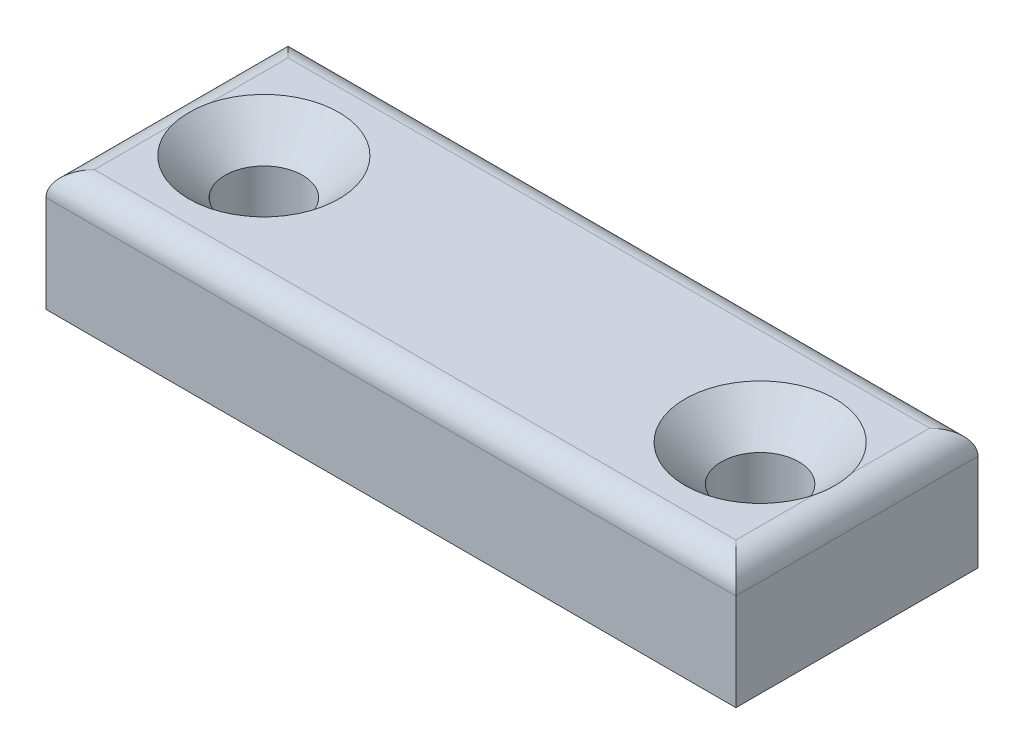
ISO-10303-21;
HEADER;
FILE_DESCRIPTION(('STEP AP214'),'2;1');
FILE_NAME('part.step','',(''),(''),'','','');
FILE_SCHEMA(('AUTOMOTIVE_DESIGN { 1 0 10303 214 1 1 1 1 }'));
ENDSEC;
DATA;
#1=APPLICATION_CONTEXT('core data for automotive mechanical design processes');
#2=APPLICATION_PROTOCOL_DEFINITION('international standard','automotive_design',2000,#1);
#3=PRODUCT_CONTEXT('',#1,'mechanical');
#4=PRODUCT('Part','Part','',(#3));
#5=PRODUCT_RELATED_PRODUCT_CATEGORY('part','',(#4));
#6=PRODUCT_DEFINITION_FORMATION('','',#4);
#7=PRODUCT_DEFINITION_CONTEXT('part definition',#1,'design');
#8=PRODUCT_DEFINITION('design','',#6,#7);
#9=PRODUCT_DEFINITION_SHAPE('','',#8);
#10=(LENGTH_UNIT() NAMED_UNIT(*) SI_UNIT(.MILLI.,.METRE.));
#11=(NAMED_UNIT(*) PLANE_ANGLE_UNIT() SI_UNIT($,.RADIAN.));
#12=(NAMED_UNIT(*) SI_UNIT($,.STERADIAN.) SOLID_ANGLE_UNIT());
#13=UNCERTAINTY_MEASURE_WITH_UNIT(LENGTH_MEASURE(1.E-05),#10,'distance_accuracy_value','');
#14=(GEOMETRIC_REPRESENTATION_CONTEXT(3) GLOBAL_UNCERTAINTY_ASSIGNED_CONTEXT((#13)) GLOBAL_UNIT_ASSIGNED_CONTEXT((#10,
#11,#12)) REPRESENTATION_CONTEXT('',''));
#15=CARTESIAN_POINT('',(0.,0.,0.));
#16=DIRECTION('',(0.,0.,1.));
#17=DIRECTION('',(1.,0.,0.));
#18=AXIS2_PLACEMENT_3D('',#15,#16,#17);
#19=CARTESIAN_POINT('',(0.,5.,0.));
#20=DIRECTION('',(0.,1.,0.));
#21=DIRECTION('',(0.,0.,1.));
#22=AXIS2_PLACEMENT_3D('',#19,#20,#21);
#23=PLANE('',#22);
#24=DIRECTION('',(0.,0.,1.));
#25=VECTOR('',#24,1.);
#26=CARTESIAN_POINT('',(-27.5,5.,0.));
#27=LINE('',#26,#25);
#28=CARTESIAN_POINT('',(-27.5,5.,-9.));
#29=VERTEX_POINT('',#28);
#30=CARTESIAN_POINT('',(-27.5,5.,-5.78102496759069));
#31=VERTEX_POINT('',#30);
#32=EDGE_CURVE('E159',#29,#31,#27,.T.);
#33=ORIENTED_EDGE('',*,*,#32,.T.);
#34=CARTESIAN_POINT('',(-24.5,5.,-5.));
#35=DIRECTION('',(0.,1.,0.));
#36=DIRECTION('',(0.,0.,1.));
#37=AXIS2_PLACEMENT_3D('',#34,#35,#36);
#38=CIRCLE('',#37,3.10000000000001);
#39=CARTESIAN_POINT('',(-27.5,5.,-4.2189750324093));
#40=VERTEX_POINT('',#39);
#41=EDGE_CURVE('E184',#31,#40,#38,.F.);
#42=ORIENTED_EDGE('',*,*,#41,.T.);
#43=CARTESIAN_POINT('',(-27.5,5.,-0.999999999999997));
#44=VERTEX_POINT('',#43);
#45=EDGE_CURVE('E158',#40,#44,#27,.T.);
#46=ORIENTED_EDGE('',*,*,#45,.T.);
#47=DIRECTION('',(1.,0.,0.));
#48=VECTOR('',#47,1.);
#49=CARTESIAN_POINT('',(0.,5.,-1.));
#50=LINE('',#49,#48);
#51=CARTESIAN_POINT('',(-1.,5.,-1.));
#52=VERTEX_POINT('',#51);
#53=EDGE_CURVE('E153',#44,#52,#50,.T.);
#54=ORIENTED_EDGE('',*,*,#53,.T.);
#55=DIRECTION('',(0.,0.,-1.));
#56=VECTOR('',#55,1.);
#57=CARTESIAN_POINT('',(-1.,5.,-10.));
#58=LINE('',#57,#56);
#59=CARTESIAN_POINT('',(-1.,5.,-4.21897503240932));
#60=VERTEX_POINT('',#59);
#61=EDGE_CURVE('E151',#52,#60,#58,.T.);
#62=ORIENTED_EDGE('',*,*,#61,.T.);
#63=CARTESIAN_POINT('',(-4.,5.,-5.));
#64=DIRECTION('',(0.,1.,0.));
#65=DIRECTION('',(0.,0.,1.));
#66=AXIS2_PLACEMENT_3D('',#63,#64,#65);
#67=CIRCLE('',#66,3.1);
#68=CARTESIAN_POINT('',(-1.,5.,-5.78102496759067));
#69=VERTEX_POINT('',#68);
#70=EDGE_CURVE('E182',#60,#69,#67,.F.);
#71=ORIENTED_EDGE('',*,*,#70,.T.);
#72=CARTESIAN_POINT('',(-1.,5.,-9.));
#73=VERTEX_POINT('',#72);
#74=EDGE_CURVE('E121',#69,#73,#58,.T.);
#75=ORIENTED_EDGE('',*,*,#74,.T.);
#76=DIRECTION('',(-1.,0.,0.));
#77=VECTOR('',#76,1.);
#78=CARTESIAN_POINT('',(-28.5,5.,-9.));
#79=LINE('',#78,#77);
#80=EDGE_CURVE('E155',#73,#29,#79,.T.);
#81=ORIENTED_EDGE('',*,*,#80,.T.);
#82=EDGE_LOOP('',(#33,#42,#46,#54,#62,#71,#75,#81));
#83=FACE_BOUND('',#82,.T.);
#84=ADVANCED_FACE('F40',(#83),#23,.T.);
#85=CARTESIAN_POINT('',(0.,0.,0.));
#86=DIRECTION('',(0.,1.,0.));
#87=DIRECTION('',(0.,0.,1.));
#88=AXIS2_PLACEMENT_3D('',#85,#86,#87);
#89=PLANE('',#88);
#90=DIRECTION('',(0.,0.,-1.));
#91=VECTOR('',#90,1.);
#92=CARTESIAN_POINT('',(0.,0.,0.));
#93=LINE('',#92,#91);
#94=CARTESIAN_POINT('',(0.,0.,0.));
#95=VERTEX_POINT('',#94);
#96=CARTESIAN_POINT('',(0.,0.,-10.));
#97=VERTEX_POINT('',#96);
#98=EDGE_CURVE('E129',#95,#97,#93,.T.);
#99=ORIENTED_EDGE('',*,*,#98,.F.);
#100=DIRECTION('',(1.,0.,0.));
#101=VECTOR('',#100,1.);
#102=CARTESIAN_POINT('',(0.,0.,0.));
#103=LINE('',#102,#101);
#104=CARTESIAN_POINT('',(-28.5,0.,0.));
#105=VERTEX_POINT('',#104);
#106=EDGE_CURVE('E145',#105,#95,#103,.T.);
#107=ORIENTED_EDGE('',*,*,#106,.F.);
#108=DIRECTION('',(0.,0.,1.));
#109=VECTOR('',#108,1.);
#110=CARTESIAN_POINT('',(-28.5,0.,0.));
#111=LINE('',#110,#109);
#112=CARTESIAN_POINT('',(-28.5,0.,-10.));
#113=VERTEX_POINT('',#112);
#114=EDGE_CURVE('E131',#113,#105,#111,.T.);
#115=ORIENTED_EDGE('',*,*,#114,.F.);
#116=DIRECTION('',(-1.,0.,0.));
#117=VECTOR('',#116,1.);
#118=CARTESIAN_POINT('',(0.,0.,-10.));
#119=LINE('',#118,#117);
#120=EDGE_CURVE('E115',#97,#113,#119,.T.);
#121=ORIENTED_EDGE('',*,*,#120,.F.);
#122=EDGE_LOOP('',(#99,#107,#115,#121));
#123=FACE_BOUND('',#122,.T.);
#124=CARTESIAN_POINT('',(-4.,0.,-5.));
#125=DIRECTION('',(0.,1.,0.));
#126=DIRECTION('',(0.,0.,1.));
#127=AXIS2_PLACEMENT_3D('',#124,#125,#126);
#128=CIRCLE('',#127,1.6);
#129=CARTESIAN_POINT('',(-4.,0.,-3.4));
#130=VERTEX_POINT('',#129);
#131=EDGE_CURVE('E137',#130,#130,#128,.T.);
#132=ORIENTED_EDGE('',*,*,#131,.T.);
#133=EDGE_LOOP('',(#132));
#134=FACE_BOUND('',#133,.T.);
#135=CARTESIAN_POINT('',(-24.5,0.,-5.));
#136=DIRECTION('',(0.,1.,0.));
#137=DIRECTION('',(0.,0.,1.));
#138=AXIS2_PLACEMENT_3D('',#135,#136,#137);
#139=CIRCLE('',#138,1.6);
#140=CARTESIAN_POINT('',(-24.5,0.,-3.4));
#141=VERTEX_POINT('',#140);
#142=EDGE_CURVE('E140',#141,#141,#139,.T.);
#143=ORIENTED_EDGE('',*,*,#142,.T.);
#144=EDGE_LOOP('',(#143));
#145=FACE_BOUND('',#144,.T.);
#146=ADVANCED_FACE('F126',(#123,#134,#145),#89,.F.);
#147=CARTESIAN_POINT('',(0.,5.,0.));
#148=DIRECTION('',(-1.,0.,0.));
#149=DIRECTION('',(0.,0.,1.));
#150=AXIS2_PLACEMENT_3D('',#147,#148,#149);
#151=PLANE('',#150);
#152=DIRECTION('',(0.,-1.,0.));
#153=VECTOR('',#152,1.);
#154=CARTESIAN_POINT('',(0.,5.,-10.));
#155=LINE('',#154,#153);
#156=CARTESIAN_POINT('',(0.,4.,-10.));
#157=VERTEX_POINT('',#156);
#158=EDGE_CURVE('E111',#157,#97,#155,.T.);
#159=ORIENTED_EDGE('',*,*,#158,.F.);
#160=DIRECTION('',(0.,0.,-1.));
#161=VECTOR('',#160,1.);
#162=CARTESIAN_POINT('',(0.,4.,0.));
#163=LINE('',#162,#161);
#164=CARTESIAN_POINT('',(0.,4.,0.));
#165=VERTEX_POINT('',#164);
#166=EDGE_CURVE('E167',#157,#165,#163,.F.);
#167=ORIENTED_EDGE('',*,*,#166,.T.);
#168=DIRECTION('',(0.,-1.,0.));
#169=VECTOR('',#168,1.);
#170=CARTESIAN_POINT('',(0.,5.,0.));
#171=LINE('',#170,#169);
#172=EDGE_CURVE('E135',#165,#95,#171,.T.);
#173=ORIENTED_EDGE('',*,*,#172,.T.);
#174=ORIENTED_EDGE('',*,*,#98,.T.);
#175=EDGE_LOOP('',(#159,#167,#173,#174));
#176=FACE_BOUND('',#175,.T.);
#177=ADVANCED_FACE('F133',(#176),#151,.F.);
#178=CARTESIAN_POINT('',(0.,5.,-10.));
#179=DIRECTION('',(0.,0.,1.));
#180=DIRECTION('',(1.,0.,0.));
#181=AXIS2_PLACEMENT_3D('',#178,#179,#180);
#182=PLANE('',#181);
#183=DIRECTION('',(0.,-1.,0.));
#184=VECTOR('',#183,1.);
#185=CARTESIAN_POINT('',(-28.5,5.,-10.));
#186=LINE('',#185,#184);
#187=CARTESIAN_POINT('',(-28.5,4.,-10.));
#188=VERTEX_POINT('',#187);
#189=EDGE_CURVE('E122',#188,#113,#186,.T.);
#190=ORIENTED_EDGE('',*,*,#189,.F.);
#191=DIRECTION('',(-1.,0.,0.));
#192=VECTOR('',#191,1.);
#193=CARTESIAN_POINT('',(0.,4.,-10.));
#194=LINE('',#193,#192);
#195=EDGE_CURVE('E118',#188,#157,#194,.F.);
#196=ORIENTED_EDGE('',*,*,#195,.T.);
#197=ORIENTED_EDGE('',*,*,#158,.T.);
#198=ORIENTED_EDGE('',*,*,#120,.T.);
#199=EDGE_LOOP('',(#190,#196,#197,#198));
#200=FACE_BOUND('',#199,.T.);
#201=ADVANCED_FACE('F114',(#200),#182,.F.);
#202=CARTESIAN_POINT('',(-28.5,5.,0.));
#203=DIRECTION('',(1.,0.,0.));
#204=DIRECTION('',(0.,0.,-1.));
#205=AXIS2_PLACEMENT_3D('',#202,#203,#204);
#206=PLANE('',#205);
#207=DIRECTION('',(0.,-1.,0.));
#208=VECTOR('',#207,1.);
#209=CARTESIAN_POINT('',(-28.5,5.,0.));
#210=LINE('',#209,#208);
#211=CARTESIAN_POINT('',(-28.5,4.,0.));
#212=VERTEX_POINT('',#211);
#213=EDGE_CURVE('E148',#212,#105,#210,.T.);
#214=ORIENTED_EDGE('',*,*,#213,.F.);
#215=DIRECTION('',(0.,0.,1.));
#216=VECTOR('',#215,1.);
#217=CARTESIAN_POINT('',(-28.5,4.,-10.));
#218=LINE('',#217,#216);
#219=EDGE_CURVE('E165',#212,#188,#218,.F.);
#220=ORIENTED_EDGE('',*,*,#219,.T.);
#221=ORIENTED_EDGE('',*,*,#189,.T.);
#222=ORIENTED_EDGE('',*,*,#114,.T.);
#223=EDGE_LOOP('',(#214,#220,#221,#222));
#224=FACE_BOUND('',#223,.T.);
#225=ADVANCED_FACE('F230',(#224),#206,.F.);
#226=CARTESIAN_POINT('',(0.,5.,0.));
#227=DIRECTION('',(0.,0.,-1.));
#228=DIRECTION('',(-1.,0.,0.));
#229=AXIS2_PLACEMENT_3D('',#226,#227,#228);
#230=PLANE('',#229);
#231=ORIENTED_EDGE('',*,*,#172,.F.);
#232=DIRECTION('',(1.,0.,0.));
#233=VECTOR('',#232,1.);
#234=CARTESIAN_POINT('',(-28.5,4.,0.));
#235=LINE('',#234,#233);
#236=EDGE_CURVE('E163',#165,#212,#235,.F.);
#237=ORIENTED_EDGE('',*,*,#236,.T.);
#238=ORIENTED_EDGE('',*,*,#213,.T.);
#239=ORIENTED_EDGE('',*,*,#106,.T.);
#240=EDGE_LOOP('',(#231,#237,#238,#239));
#241=FACE_BOUND('',#240,.T.);
#242=ADVANCED_FACE('F227',(#241),#230,.F.);
#243=CARTESIAN_POINT('',(-4.,5.,-5.));
#244=DIRECTION('',(0.,-1.,0.));
#245=DIRECTION('',(0.,0.,-1.));
#246=AXIS2_PLACEMENT_3D('',#243,#244,#245);
#247=CYLINDRICAL_SURFACE('',#246,1.6);
#248=CARTESIAN_POINT('',(-4.,3.5,-5.));
#249=DIRECTION('',(0.,1.,0.));
#250=DIRECTION('',(0.,0.,1.));
#251=AXIS2_PLACEMENT_3D('',#248,#249,#250);
#252=CIRCLE('',#251,1.6);
#253=CARTESIAN_POINT('',(-4.,3.5,-3.4));
#254=VERTEX_POINT('',#253);
#255=EDGE_CURVE('E55',#254,#254,#252,.T.);
#256=ORIENTED_EDGE('',*,*,#255,.T.);
#257=EDGE_LOOP('',(#256));
#258=FACE_BOUND('',#257,.T.);
#259=ORIENTED_EDGE('',*,*,#131,.F.);
#260=EDGE_LOOP('',(#259));
#261=FACE_BOUND('',#260,.T.);
#262=ADVANCED_FACE('F224',(#258,#261),#247,.F.);
#263=CARTESIAN_POINT('',(-24.5,5.,-5.));
#264=DIRECTION('',(0.,-1.,0.));
#265=DIRECTION('',(0.,0.,-1.));
#266=AXIS2_PLACEMENT_3D('',#263,#264,#265);
#267=CYLINDRICAL_SURFACE('',#266,1.6);
#268=CARTESIAN_POINT('',(-24.5,3.5,-5.));
#269=DIRECTION('',(0.,1.,0.));
#270=DIRECTION('',(0.,0.,1.));
#271=AXIS2_PLACEMENT_3D('',#268,#269,#270);
#272=CIRCLE('',#271,1.6);
#273=CARTESIAN_POINT('',(-24.5,3.5,-3.4));
#274=VERTEX_POINT('',#273);
#275=EDGE_CURVE('E169',#274,#274,#272,.T.);
#276=ORIENTED_EDGE('',*,*,#275,.T.);
#277=EDGE_LOOP('',(#276));
#278=FACE_BOUND('',#277,.T.);
#279=ORIENTED_EDGE('',*,*,#142,.F.);
#280=EDGE_LOOP('',(#279));
#281=FACE_BOUND('',#280,.T.);
#282=ADVANCED_FACE('F208',(#278,#281),#267,.F.);
#283=CARTESIAN_POINT('',(0.,4.,-1.));
#284=DIRECTION('',(-1.,0.,0.));
#285=DIRECTION('',(0.,0.,1.));
#286=AXIS2_PLACEMENT_3D('',#283,#284,#285);
#287=CYLINDRICAL_SURFACE('',#286,1.);
#288=CARTESIAN_POINT('',(-27.5,4.,-0.999999999999997));
#289=DIRECTION('',(-0.707106781186548,0.,-0.707106781186547));
#290=DIRECTION('',(0.707106781186547,0.,-0.707106781186548));
#291=AXIS2_PLACEMENT_3D('',#288,#289,#290);
#292=ELLIPSE('',#291,1.4142135623731,1.);
#293=EDGE_CURVE('E174',#212,#44,#292,.T.);
#294=ORIENTED_EDGE('',*,*,#293,.F.);
#295=ORIENTED_EDGE('',*,*,#236,.F.);
#296=CARTESIAN_POINT('',(-1.,4.,-1.));
#297=DIRECTION('',(-0.707106781186547,0.,0.707106781186548));
#298=DIRECTION('',(0.707106781186548,0.,0.707106781186547));
#299=AXIS2_PLACEMENT_3D('',#296,#297,#298);
#300=ELLIPSE('',#299,1.41421356237309,1.);
#301=EDGE_CURVE('E177',#52,#165,#300,.F.);
#302=ORIENTED_EDGE('',*,*,#301,.F.);
#303=ORIENTED_EDGE('',*,*,#53,.F.);
#304=EDGE_LOOP('',(#294,#295,#302,#303));
#305=FACE_BOUND('',#304,.T.);
#306=ADVANCED_FACE('F205',(#305),#287,.T.);
#307=CARTESIAN_POINT('',(-1.,4.,0.));
#308=DIRECTION('',(0.,0.,1.));
#309=DIRECTION('',(1.,0.,0.));
#310=AXIS2_PLACEMENT_3D('',#307,#308,#309);
#311=CYLINDRICAL_SURFACE('',#310,1.);
#312=ORIENTED_EDGE('',*,*,#74,.F.);
#313=CARTESIAN_POINT('',(-1.,5.,-5.78102496759067));
#314=CARTESIAN_POINT('',(-0.989422035396968,4.9999936611314,-5.74036875513476));
#315=CARTESIAN_POINT('',(-0.979823018712966,4.99983277072323,-5.69946978398594));
#316=CARTESIAN_POINT('',(-0.962470322563194,4.99933454221726,-5.61729344861421));
#317=CARTESIAN_POINT('',(-0.954716157548253,4.99899725062164,-5.57601618693091));
#318=CARTESIAN_POINT('',(-0.93405196988496,4.99791985439271,-5.45178921017818));
#319=CARTESIAN_POINT('',(-0.923729266926521,4.99711394002244,-5.36840092486853));
#320=CARTESIAN_POINT('',(-0.909609895562619,4.99593003033919,-5.20264203842099));
#321=CARTESIAN_POINT('',(-0.905696236002157,4.9955444077953,-5.12028108002218));
#322=CARTESIAN_POINT('',(-0.903855838160186,4.99536734003082,-4.95549983295622));
#323=CARTESIAN_POINT('',(-0.905928840104376,4.99557586902871,-4.87307954701856));
#324=CARTESIAN_POINT('',(-0.916995841454376,4.99657044135816,-4.69494636205821));
#325=CARTESIAN_POINT('',(-0.927080715928093,4.99744653351892,-4.59929606225288));
#326=CARTESIAN_POINT('',(-0.948954221705746,4.99872214681978,-4.45634712533243));
#327=CARTESIAN_POINT('',(-0.957434196082679,4.9991430982129,-4.4085283482674));
#328=CARTESIAN_POINT('',(-0.976839867074671,4.99977663543495,-4.3133579151763));
#329=CARTESIAN_POINT('',(-0.987767140122242,4.99998908648107,-4.26600658087352));
#330=CARTESIAN_POINT('',(-0.999999999999502,5.00000000000048,-4.21897503240929));
#331=B_SPLINE_CURVE_WITH_KNOTS('',3,(#313,#314,#315,#316,#317,#318,#319,#320,#321,#322,#323,
#324,#325,#326,#327,#328,#329,#330),.UNSPECIFIED.,.F.,.F.,(4,2,2,2,2,2,2,2,4),(0.,
0.125997910768511,0.251962623189755,0.503758247775796,0.750904158137535,0.998039344460239,
1.28616380812984,1.43180844725233,1.57754717489195),.UNSPECIFIED.);
#332=EDGE_CURVE('E11',#69,#60,#331,.T.);
#333=ORIENTED_EDGE('',*,*,#332,.T.);
#334=ORIENTED_EDGE('',*,*,#61,.F.);
#335=ORIENTED_EDGE('',*,*,#301,.T.);
#336=ORIENTED_EDGE('',*,*,#166,.F.);
#337=CARTESIAN_POINT('',(-1.,4.,-9.));
#338=DIRECTION('',(0.707106781186548,0.,0.707106781186547));
#339=DIRECTION('',(-0.707106781186547,0.,0.707106781186548));
#340=AXIS2_PLACEMENT_3D('',#337,#338,#339);
#341=ELLIPSE('',#340,1.4142135623731,1.);
#342=EDGE_CURVE('E172',#73,#157,#341,.F.);
#343=ORIENTED_EDGE('',*,*,#342,.F.);
#344=EDGE_LOOP('',(#312,#333,#334,#335,#336,#343));
#345=FACE_BOUND('',#344,.T.);
#346=ADVANCED_FACE('F207',(#345),#311,.T.);
#347=CARTESIAN_POINT('',(-27.5,4.,0.));
#348=DIRECTION('',(0.,0.,-1.));
#349=DIRECTION('',(-1.,0.,0.));
#350=AXIS2_PLACEMENT_3D('',#347,#348,#349);
#351=CYLINDRICAL_SURFACE('',#350,1.);
#352=ORIENTED_EDGE('',*,*,#45,.F.);
#353=CARTESIAN_POINT('',(-27.5,5.,-4.2189750324093));
#354=CARTESIAN_POINT('',(-27.510577964603,4.9999936611314,-4.25963124486522));
#355=CARTESIAN_POINT('',(-27.520176981287,4.99983277072323,-4.30053021601403));
#356=CARTESIAN_POINT('',(-27.5375296774368,4.99933454221726,-4.38270655138576));
#357=CARTESIAN_POINT('',(-27.5452838424517,4.99899725062164,-4.42398381306907));
#358=CARTESIAN_POINT('',(-27.565948030115,4.99791985439271,-4.5482107898218));
#359=CARTESIAN_POINT('',(-27.5762707330735,4.99711394002244,-4.63159907513145));
#360=CARTESIAN_POINT('',(-27.5903901044374,4.99593003033919,-4.79735796157898));
#361=CARTESIAN_POINT('',(-27.5943037639978,4.9955444077953,-4.87971891997779));
#362=CARTESIAN_POINT('',(-27.5961441618398,4.99536734003082,-5.04450016704376));
#363=CARTESIAN_POINT('',(-27.5940711598956,4.99557586902871,-5.12692045298141));
#364=CARTESIAN_POINT('',(-27.5830041585456,4.99657044135816,-5.30505363794177));
#365=CARTESIAN_POINT('',(-27.5729192840719,4.99744653351892,-5.40070393774711));
#366=CARTESIAN_POINT('',(-27.5510457782943,4.99872214681978,-5.54365287466757));
#367=CARTESIAN_POINT('',(-27.5425658039173,4.9991430982129,-5.5914716517326));
#368=CARTESIAN_POINT('',(-27.5231601329253,4.99977663543495,-5.6866420848237));
#369=CARTESIAN_POINT('',(-27.5122328598778,4.99998908648107,-5.73399341912649));
#370=CARTESIAN_POINT('',(-27.5000000000005,5.00000000000048,-5.78102496759072));
#371=B_SPLINE_CURVE_WITH_KNOTS('',3,(#353,#354,#355,#356,#357,#358,#359,#360,#361,#362,#363,
#364,#365,#366,#367,#368,#369,#370),.UNSPECIFIED.,.F.,.F.,(4,2,2,2,2,2,2,2,4),(0.,
0.125997910768511,0.251962623189754,0.503758247775794,0.750904158137532,0.998039344460237,
1.28616380812986,1.43180844725236,1.57754717489199),.UNSPECIFIED.);
#372=EDGE_CURVE('E187',#40,#31,#371,.T.);
#373=ORIENTED_EDGE('',*,*,#372,.T.);
#374=ORIENTED_EDGE('',*,*,#32,.F.);
#375=CARTESIAN_POINT('',(-27.5,4.,-9.));
#376=DIRECTION('',(0.707106781186547,0.,-0.707106781186548));
#377=DIRECTION('',(-0.707106781186548,0.,-0.707106781186547));
#378=AXIS2_PLACEMENT_3D('',#375,#376,#377);
#379=ELLIPSE('',#378,1.41421356237309,1.);
#380=EDGE_CURVE('E170',#188,#29,#379,.T.);
#381=ORIENTED_EDGE('',*,*,#380,.F.);
#382=ORIENTED_EDGE('',*,*,#219,.F.);
#383=ORIENTED_EDGE('',*,*,#293,.T.);
#384=EDGE_LOOP('',(#352,#373,#374,#381,#382,#383));
#385=FACE_BOUND('',#384,.T.);
#386=ADVANCED_FACE('F193',(#385),#351,.T.);
#387=CARTESIAN_POINT('',(0.,4.,-9.));
#388=DIRECTION('',(1.,0.,0.));
#389=DIRECTION('',(0.,0.,-1.));
#390=AXIS2_PLACEMENT_3D('',#387,#388,#389);
#391=CYLINDRICAL_SURFACE('',#390,1.);
#392=ORIENTED_EDGE('',*,*,#342,.T.);
#393=ORIENTED_EDGE('',*,*,#195,.F.);
#394=ORIENTED_EDGE('',*,*,#380,.T.);
#395=ORIENTED_EDGE('',*,*,#80,.F.);
#396=EDGE_LOOP('',(#392,#393,#394,#395));
#397=FACE_BOUND('',#396,.T.);
#398=ADVANCED_FACE('F203',(#397),#391,.T.);
#399=CARTESIAN_POINT('',(-24.5,3.5,-5.));
#400=DIRECTION('',(0.,1.,0.));
#401=DIRECTION('',(0.,0.,1.));
#402=AXIS2_PLACEMENT_3D('',#399,#400,#401);
#403=CONICAL_SURFACE('',#402,1.6,0.785398163397449);
#404=ORIENTED_EDGE('',*,*,#372,.F.);
#405=ORIENTED_EDGE('',*,*,#41,.F.);
#406=EDGE_LOOP('',(#404,#405));
#407=FACE_BOUND('',#406,.T.);
#408=ORIENTED_EDGE('',*,*,#275,.F.);
#409=EDGE_LOOP('',(#408));
#410=FACE_BOUND('',#409,.T.);
#411=ADVANCED_FACE('F197',(#407,#410),#403,.F.);
#412=CARTESIAN_POINT('',(-4.,3.5,-5.));
#413=DIRECTION('',(0.,1.,0.));
#414=DIRECTION('',(0.,0.,1.));
#415=AXIS2_PLACEMENT_3D('',#412,#413,#414);
#416=CONICAL_SURFACE('',#415,1.6,0.78539816339745);
#417=ORIENTED_EDGE('',*,*,#332,.F.);
#418=ORIENTED_EDGE('',*,*,#70,.F.);
#419=EDGE_LOOP('',(#417,#418));
#420=FACE_BOUND('',#419,.T.);
#421=ORIENTED_EDGE('',*,*,#255,.F.);
#422=EDGE_LOOP('',(#421));
#423=FACE_BOUND('',#422,.T.);
#424=ADVANCED_FACE('F43',(#420,#423),#416,.F.);
#425=CLOSED_SHELL('',(#84,#146,#177,#201,#225,#242,#262,#282,#306,#346,#386,#398,#411,#424));
#426=MANIFOLD_SOLID_BREP('B2',#425);
#427=ADVANCED_BREP_SHAPE_REPRESENTATION('',(#18,#426),#14);
#428=SHAPE_DEFINITION_REPRESENTATION(#9,#427);
ENDSEC;
END-ISO-10303-21;
